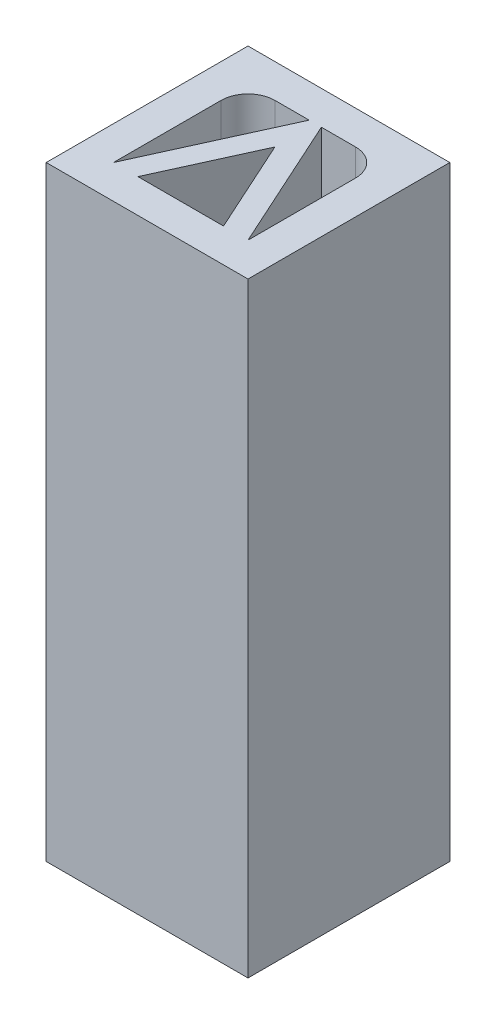
ISO-10303-21;
HEADER;
FILE_DESCRIPTION(('STEP AP214'),'2;1');
FILE_NAME('part.step','',(''),(''),'','','');
FILE_SCHEMA(('AUTOMOTIVE_DESIGN { 1 0 10303 214 1 1 1 1 }'));
ENDSEC;
DATA;
#1=APPLICATION_CONTEXT('core data for automotive mechanical design processes');
#2=APPLICATION_PROTOCOL_DEFINITION('international standard','automotive_design',2000,#1);
#3=PRODUCT_CONTEXT('',#1,'mechanical');
#4=PRODUCT('Part','Part','',(#3));
#5=PRODUCT_RELATED_PRODUCT_CATEGORY('part','',(#4));
#6=PRODUCT_DEFINITION_FORMATION('','',#4);
#7=PRODUCT_DEFINITION_CONTEXT('part definition',#1,'design');
#8=PRODUCT_DEFINITION('design','',#6,#7);
#9=PRODUCT_DEFINITION_SHAPE('','',#8);
#10=(LENGTH_UNIT() NAMED_UNIT(*) SI_UNIT(.MILLI.,.METRE.));
#11=(NAMED_UNIT(*) PLANE_ANGLE_UNIT() SI_UNIT($,.RADIAN.));
#12=(NAMED_UNIT(*) SI_UNIT($,.STERADIAN.) SOLID_ANGLE_UNIT());
#13=UNCERTAINTY_MEASURE_WITH_UNIT(LENGTH_MEASURE(1.E-05),#10,'distance_accuracy_value','');
#14=(GEOMETRIC_REPRESENTATION_CONTEXT(3) GLOBAL_UNCERTAINTY_ASSIGNED_CONTEXT((#13)) GLOBAL_UNIT_ASSIGNED_CONTEXT((#10,
#11,#12)) REPRESENTATION_CONTEXT('',''));
#15=CARTESIAN_POINT('',(0.,0.,0.));
#16=DIRECTION('',(0.,0.,1.));
#17=DIRECTION('',(1.,0.,0.));
#18=AXIS2_PLACEMENT_3D('',#15,#16,#17);
#19=CARTESIAN_POINT('',(2.5,45.,-12.5));
#20=DIRECTION('',(0.,0.,1.));
#21=DIRECTION('',(1.,0.,0.));
#22=AXIS2_PLACEMENT_3D('',#19,#20,#21);
#23=PLANE('',#22);
#24=DIRECTION('',(-1.,0.,0.));
#25=VECTOR('',#24,1.);
#26=CARTESIAN_POINT('',(2.5,0.,-12.5));
#27=LINE('',#26,#25);
#28=CARTESIAN_POINT('',(10.5,0.,-12.5));
#29=VERTEX_POINT('',#28);
#30=CARTESIAN_POINT('',(7.95454545454545,0.,-12.5));
#31=VERTEX_POINT('',#30);
#32=EDGE_CURVE('E200',#29,#31,#27,.T.);
#33=ORIENTED_EDGE('',*,*,#32,.F.);
#34=DIRECTION('',(0.,-1.,0.));
#35=VECTOR('',#34,1.);
#36=CARTESIAN_POINT('',(10.5,45.,-12.5));
#37=LINE('',#36,#35);
#38=CARTESIAN_POINT('',(10.5,45.,-12.5));
#39=VERTEX_POINT('',#38);
#40=EDGE_CURVE('E55',#29,#39,#37,.F.);
#41=ORIENTED_EDGE('',*,*,#40,.T.);
#42=DIRECTION('',(-1.,0.,0.));
#43=VECTOR('',#42,1.);
#44=CARTESIAN_POINT('',(2.5,45.,-12.5));
#45=LINE('',#44,#43);
#46=CARTESIAN_POINT('',(7.95454545454545,45.,-12.5));
#47=VERTEX_POINT('',#46);
#48=EDGE_CURVE('E208',#39,#47,#45,.T.);
#49=ORIENTED_EDGE('',*,*,#48,.T.);
#50=DIRECTION('',(0.,1.,0.));
#51=VECTOR('',#50,1.);
#52=CARTESIAN_POINT('',(7.95454545454545,45.,-12.5));
#53=LINE('',#52,#51);
#54=EDGE_CURVE('E277',#31,#47,#53,.T.);
#55=ORIENTED_EDGE('',*,*,#54,.F.);
#56=EDGE_LOOP('',(#33,#41,#49,#55));
#57=FACE_BOUND('',#56,.T.);
#58=ADVANCED_FACE('F39',(#57),#23,.T.);
#59=CARTESIAN_POINT('',(0.,45.,0.));
#60=DIRECTION('',(0.,-1.,0.));
#61=DIRECTION('',(0.,0.,-1.));
#62=AXIS2_PLACEMENT_3D('',#59,#60,#61);
#63=PLANE('',#62);
#64=DIRECTION('',(0.413802944301184,0.,0.910366477462605));
#65=VECTOR('',#64,1.);
#66=CARTESIAN_POINT('',(12.5,45.,-2.5));
#67=LINE('',#66,#65);
#68=CARTESIAN_POINT('',(12.5,45.,-2.5));
#69=VERTEX_POINT('',#68);
#70=EDGE_CURVE('E181',#47,#69,#67,.T.);
#71=ORIENTED_EDGE('',*,*,#70,.F.);
#72=ORIENTED_EDGE('',*,*,#48,.F.);
#73=CARTESIAN_POINT('',(10.5,45.,-10.5));
#74=DIRECTION('',(0.,-1.,0.));
#75=DIRECTION('',(0.,0.,-1.));
#76=AXIS2_PLACEMENT_3D('',#73,#74,#75);
#77=CIRCLE('',#76,2.);
#78=CARTESIAN_POINT('',(12.5,45.,-10.5));
#79=VERTEX_POINT('',#78);
#80=EDGE_CURVE('E11',#39,#79,#77,.T.);
#81=ORIENTED_EDGE('',*,*,#80,.T.);
#82=DIRECTION('',(0.,0.,-1.));
#83=VECTOR('',#82,1.);
#84=CARTESIAN_POINT('',(12.5,45.,-12.5));
#85=LINE('',#84,#83);
#86=EDGE_CURVE('E203',#69,#79,#85,.T.);
#87=ORIENTED_EDGE('',*,*,#86,.F.);
#88=EDGE_LOOP('',(#71,#72,#81,#87));
#89=FACE_BOUND('',#88,.T.);
#90=DIRECTION('',(-0.413802944301184,0.,-0.910366477462605));
#91=VECTOR('',#90,1.);
#92=CARTESIAN_POINT('',(10.6818181818182,45.,-2.5));
#93=LINE('',#92,#91);
#94=CARTESIAN_POINT('',(10.6818181818182,45.,-2.5));
#95=VERTEX_POINT('',#94);
#96=CARTESIAN_POINT('',(7.5,45.,-9.5));
#97=VERTEX_POINT('',#96);
#98=EDGE_CURVE('E164',#95,#97,#93,.T.);
#99=ORIENTED_EDGE('',*,*,#98,.F.);
#100=DIRECTION('',(1.,0.,0.));
#101=VECTOR('',#100,1.);
#102=CARTESIAN_POINT('',(2.5,45.,-2.5));
#103=LINE('',#102,#101);
#104=CARTESIAN_POINT('',(4.31818181818182,45.,-2.5));
#105=VERTEX_POINT('',#104);
#106=EDGE_CURVE('E165',#105,#95,#103,.T.);
#107=ORIENTED_EDGE('',*,*,#106,.F.);
#108=DIRECTION('',(-0.413802944301184,0.,0.910366477462605));
#109=VECTOR('',#108,1.);
#110=CARTESIAN_POINT('',(7.5,45.,-9.5));
#111=LINE('',#110,#109);
#112=EDGE_CURVE('E148',#97,#105,#111,.T.);
#113=ORIENTED_EDGE('',*,*,#112,.F.);
#114=EDGE_LOOP('',(#99,#107,#113));
#115=FACE_BOUND('',#114,.T.);
#116=DIRECTION('',(0.,0.,1.));
#117=VECTOR('',#116,1.);
#118=CARTESIAN_POINT('',(0.,45.,0.));
#119=LINE('',#118,#117);
#120=CARTESIAN_POINT('',(0.,45.,-15.));
#121=VERTEX_POINT('',#120);
#122=CARTESIAN_POINT('',(0.,45.,0.));
#123=VERTEX_POINT('',#122);
#124=EDGE_CURVE('E232',#121,#123,#119,.T.);
#125=ORIENTED_EDGE('',*,*,#124,.T.);
#126=DIRECTION('',(1.,0.,0.));
#127=VECTOR('',#126,1.);
#128=CARTESIAN_POINT('',(0.,45.,0.));
#129=LINE('',#128,#127);
#130=CARTESIAN_POINT('',(15.,45.,0.));
#131=VERTEX_POINT('',#130);
#132=EDGE_CURVE('E236',#123,#131,#129,.T.);
#133=ORIENTED_EDGE('',*,*,#132,.T.);
#134=DIRECTION('',(0.,0.,-1.));
#135=VECTOR('',#134,1.);
#136=CARTESIAN_POINT('',(15.,45.,0.));
#137=LINE('',#136,#135);
#138=CARTESIAN_POINT('',(15.,45.,-15.));
#139=VERTEX_POINT('',#138);
#140=EDGE_CURVE('E240',#131,#139,#137,.T.);
#141=ORIENTED_EDGE('',*,*,#140,.T.);
#142=DIRECTION('',(-1.,0.,0.));
#143=VECTOR('',#142,1.);
#144=CARTESIAN_POINT('',(0.,45.,-15.));
#145=LINE('',#144,#143);
#146=EDGE_CURVE('E243',#139,#121,#145,.T.);
#147=ORIENTED_EDGE('',*,*,#146,.T.);
#148=EDGE_LOOP('',(#125,#133,#141,#147));
#149=FACE_BOUND('',#148,.T.);
#150=CARTESIAN_POINT('',(7.04545454545455,45.,-12.5));
#151=VERTEX_POINT('',#150);
#152=CARTESIAN_POINT('',(4.5,45.,-12.5));
#153=VERTEX_POINT('',#152);
#154=EDGE_CURVE('E207',#151,#153,#45,.T.);
#155=ORIENTED_EDGE('',*,*,#154,.F.);
#156=DIRECTION('',(0.413802944301184,0.,-0.910366477462605));
#157=VECTOR('',#156,1.);
#158=CARTESIAN_POINT('',(7.5,45.,-13.5));
#159=LINE('',#158,#157);
#160=CARTESIAN_POINT('',(2.5,45.,-2.5));
#161=VERTEX_POINT('',#160);
#162=EDGE_CURVE('E167',#161,#151,#159,.T.);
#163=ORIENTED_EDGE('',*,*,#162,.F.);
#164=DIRECTION('',(0.,0.,1.));
#165=VECTOR('',#164,1.);
#166=CARTESIAN_POINT('',(2.5,45.,-12.5));
#167=LINE('',#166,#165);
#168=CARTESIAN_POINT('',(2.5,45.,-10.5));
#169=VERTEX_POINT('',#168);
#170=EDGE_CURVE('E197',#169,#161,#167,.T.);
#171=ORIENTED_EDGE('',*,*,#170,.F.);
#172=CARTESIAN_POINT('',(4.5,45.,-10.5));
#173=DIRECTION('',(0.,-1.,0.));
#174=DIRECTION('',(0.,0.,-1.));
#175=AXIS2_PLACEMENT_3D('',#172,#173,#174);
#176=CIRCLE('',#175,2.);
#177=EDGE_CURVE('E297',#169,#153,#176,.T.);
#178=ORIENTED_EDGE('',*,*,#177,.T.);
#179=EDGE_LOOP('',(#155,#163,#171,#178));
#180=FACE_BOUND('',#179,.T.);
#181=ADVANCED_FACE('F162',(#89,#115,#149,#180),#63,.F.);
#182=CARTESIAN_POINT('',(0.,0.,0.));
#183=DIRECTION('',(0.,-1.,0.));
#184=DIRECTION('',(0.,0.,-1.));
#185=AXIS2_PLACEMENT_3D('',#182,#183,#184);
#186=PLANE('',#185);
#187=DIRECTION('',(0.,0.,-1.));
#188=VECTOR('',#187,1.);
#189=CARTESIAN_POINT('',(12.5,0.,-12.5));
#190=LINE('',#189,#188);
#191=CARTESIAN_POINT('',(12.5,0.,-2.5));
#192=VERTEX_POINT('',#191);
#193=CARTESIAN_POINT('',(12.5,0.,-10.5));
#194=VERTEX_POINT('',#193);
#195=EDGE_CURVE('E218',#192,#194,#190,.T.);
#196=ORIENTED_EDGE('',*,*,#195,.T.);
#197=CARTESIAN_POINT('',(10.5,0.,-10.5));
#198=DIRECTION('',(0.,-1.,0.));
#199=DIRECTION('',(0.,0.,-1.));
#200=AXIS2_PLACEMENT_3D('',#197,#198,#199);
#201=CIRCLE('',#200,2.);
#202=EDGE_CURVE('E48',#194,#29,#201,.F.);
#203=ORIENTED_EDGE('',*,*,#202,.T.);
#204=ORIENTED_EDGE('',*,*,#32,.T.);
#205=DIRECTION('',(0.413802944301184,0.,0.910366477462605));
#206=VECTOR('',#205,1.);
#207=CARTESIAN_POINT('',(12.5,0.,-2.5));
#208=LINE('',#207,#206);
#209=EDGE_CURVE('E172',#31,#192,#208,.T.);
#210=ORIENTED_EDGE('',*,*,#209,.T.);
#211=EDGE_LOOP('',(#196,#203,#204,#210));
#212=FACE_BOUND('',#211,.T.);
#213=DIRECTION('',(1.,0.,0.));
#214=VECTOR('',#213,1.);
#215=CARTESIAN_POINT('',(2.5,0.,-2.5));
#216=LINE('',#215,#214);
#217=CARTESIAN_POINT('',(4.31818181818182,0.,-2.5));
#218=VERTEX_POINT('',#217);
#219=CARTESIAN_POINT('',(10.6818181818182,0.,-2.5));
#220=VERTEX_POINT('',#219);
#221=EDGE_CURVE('E214',#218,#220,#216,.T.);
#222=ORIENTED_EDGE('',*,*,#221,.T.);
#223=DIRECTION('',(-0.413802944301184,0.,-0.910366477462605));
#224=VECTOR('',#223,1.);
#225=CARTESIAN_POINT('',(10.6818181818182,0.,-2.5));
#226=LINE('',#225,#224);
#227=CARTESIAN_POINT('',(7.5,0.,-9.5));
#228=VERTEX_POINT('',#227);
#229=EDGE_CURVE('E185',#220,#228,#226,.T.);
#230=ORIENTED_EDGE('',*,*,#229,.T.);
#231=DIRECTION('',(-0.413802944301184,0.,0.910366477462605));
#232=VECTOR('',#231,1.);
#233=CARTESIAN_POINT('',(7.5,0.,-9.5));
#234=LINE('',#233,#232);
#235=EDGE_CURVE('E150',#228,#218,#234,.T.);
#236=ORIENTED_EDGE('',*,*,#235,.T.);
#237=EDGE_LOOP('',(#222,#230,#236));
#238=FACE_BOUND('',#237,.T.);
#239=DIRECTION('',(0.413802944301184,0.,-0.910366477462605));
#240=VECTOR('',#239,1.);
#241=CARTESIAN_POINT('',(7.5,0.,-13.5));
#242=LINE('',#241,#240);
#243=CARTESIAN_POINT('',(2.5,0.,-2.5));
#244=VERTEX_POINT('',#243);
#245=CARTESIAN_POINT('',(7.04545454545455,0.,-12.5));
#246=VERTEX_POINT('',#245);
#247=EDGE_CURVE('E176',#244,#246,#242,.T.);
#248=ORIENTED_EDGE('',*,*,#247,.T.);
#249=CARTESIAN_POINT('',(4.5,0.,-12.5));
#250=VERTEX_POINT('',#249);
#251=EDGE_CURVE('E221',#246,#250,#27,.T.);
#252=ORIENTED_EDGE('',*,*,#251,.T.);
#253=CARTESIAN_POINT('',(4.5,0.,-10.5));
#254=DIRECTION('',(0.,-1.,0.));
#255=DIRECTION('',(0.,0.,-1.));
#256=AXIS2_PLACEMENT_3D('',#253,#254,#255);
#257=CIRCLE('',#256,2.);
#258=CARTESIAN_POINT('',(2.5,0.,-10.5));
#259=VERTEX_POINT('',#258);
#260=EDGE_CURVE('E294',#250,#259,#257,.F.);
#261=ORIENTED_EDGE('',*,*,#260,.T.);
#262=DIRECTION('',(0.,0.,1.));
#263=VECTOR('',#262,1.);
#264=CARTESIAN_POINT('',(2.5,0.,-12.5));
#265=LINE('',#264,#263);
#266=EDGE_CURVE('E193',#259,#244,#265,.T.);
#267=ORIENTED_EDGE('',*,*,#266,.T.);
#268=EDGE_LOOP('',(#248,#252,#261,#267));
#269=FACE_BOUND('',#268,.T.);
#270=DIRECTION('',(0.,0.,1.));
#271=VECTOR('',#270,1.);
#272=CARTESIAN_POINT('',(0.,0.,0.));
#273=LINE('',#272,#271);
#274=CARTESIAN_POINT('',(0.,0.,-15.));
#275=VERTEX_POINT('',#274);
#276=CARTESIAN_POINT('',(0.,0.,0.));
#277=VERTEX_POINT('',#276);
#278=EDGE_CURVE('E231',#275,#277,#273,.T.);
#279=ORIENTED_EDGE('',*,*,#278,.F.);
#280=DIRECTION('',(-1.,0.,0.));
#281=VECTOR('',#280,1.);
#282=CARTESIAN_POINT('',(0.,0.,-15.));
#283=LINE('',#282,#281);
#284=CARTESIAN_POINT('',(15.,0.,-15.));
#285=VERTEX_POINT('',#284);
#286=EDGE_CURVE('E237',#285,#275,#283,.T.);
#287=ORIENTED_EDGE('',*,*,#286,.F.);
#288=DIRECTION('',(0.,0.,-1.));
#289=VECTOR('',#288,1.);
#290=CARTESIAN_POINT('',(15.,0.,0.));
#291=LINE('',#290,#289);
#292=CARTESIAN_POINT('',(15.,0.,0.));
#293=VERTEX_POINT('',#292);
#294=EDGE_CURVE('E253',#293,#285,#291,.T.);
#295=ORIENTED_EDGE('',*,*,#294,.F.);
#296=DIRECTION('',(1.,0.,0.));
#297=VECTOR('',#296,1.);
#298=CARTESIAN_POINT('',(0.,0.,0.));
#299=LINE('',#298,#297);
#300=EDGE_CURVE('E250',#277,#293,#299,.T.);
#301=ORIENTED_EDGE('',*,*,#300,.F.);
#302=EDGE_LOOP('',(#279,#287,#295,#301));
#303=FACE_BOUND('',#302,.T.);
#304=ADVANCED_FACE('F306',(#212,#238,#269,#303),#186,.T.);
#305=CARTESIAN_POINT('',(0.,45.,0.));
#306=DIRECTION('',(1.,0.,0.));
#307=DIRECTION('',(0.,0.,-1.));
#308=AXIS2_PLACEMENT_3D('',#305,#306,#307);
#309=PLANE('',#308);
#310=ORIENTED_EDGE('',*,*,#278,.T.);
#311=DIRECTION('',(0.,-1.,0.));
#312=VECTOR('',#311,1.);
#313=CARTESIAN_POINT('',(0.,45.,0.));
#314=LINE('',#313,#312);
#315=EDGE_CURVE('E269',#123,#277,#314,.T.);
#316=ORIENTED_EDGE('',*,*,#315,.F.);
#317=ORIENTED_EDGE('',*,*,#124,.F.);
#318=DIRECTION('',(0.,-1.,0.));
#319=VECTOR('',#318,1.);
#320=CARTESIAN_POINT('',(0.,45.,-15.));
#321=LINE('',#320,#319);
#322=EDGE_CURVE('E246',#121,#275,#321,.T.);
#323=ORIENTED_EDGE('',*,*,#322,.T.);
#324=EDGE_LOOP('',(#310,#316,#317,#323));
#325=FACE_BOUND('',#324,.T.);
#326=ADVANCED_FACE('F364',(#325),#309,.F.);
#327=CARTESIAN_POINT('',(0.,45.,0.));
#328=DIRECTION('',(0.,0.,-1.));
#329=DIRECTION('',(-1.,0.,0.));
#330=AXIS2_PLACEMENT_3D('',#327,#328,#329);
#331=PLANE('',#330);
#332=ORIENTED_EDGE('',*,*,#300,.T.);
#333=DIRECTION('',(0.,-1.,0.));
#334=VECTOR('',#333,1.);
#335=CARTESIAN_POINT('',(15.,45.,0.));
#336=LINE('',#335,#334);
#337=EDGE_CURVE('E265',#131,#293,#336,.T.);
#338=ORIENTED_EDGE('',*,*,#337,.F.);
#339=ORIENTED_EDGE('',*,*,#132,.F.);
#340=ORIENTED_EDGE('',*,*,#315,.T.);
#341=EDGE_LOOP('',(#332,#338,#339,#340));
#342=FACE_BOUND('',#341,.T.);
#343=ADVANCED_FACE('F371',(#342),#331,.F.);
#344=CARTESIAN_POINT('',(15.,45.,0.));
#345=DIRECTION('',(-1.,0.,0.));
#346=DIRECTION('',(0.,0.,1.));
#347=AXIS2_PLACEMENT_3D('',#344,#345,#346);
#348=PLANE('',#347);
#349=ORIENTED_EDGE('',*,*,#294,.T.);
#350=DIRECTION('',(0.,-1.,0.));
#351=VECTOR('',#350,1.);
#352=CARTESIAN_POINT('',(15.,45.,-15.));
#353=LINE('',#352,#351);
#354=EDGE_CURVE('E261',#139,#285,#353,.T.);
#355=ORIENTED_EDGE('',*,*,#354,.F.);
#356=ORIENTED_EDGE('',*,*,#140,.F.);
#357=ORIENTED_EDGE('',*,*,#337,.T.);
#358=EDGE_LOOP('',(#349,#355,#356,#357));
#359=FACE_BOUND('',#358,.T.);
#360=ADVANCED_FACE('F367',(#359),#348,.F.);
#361=CARTESIAN_POINT('',(0.,45.,-15.));
#362=DIRECTION('',(0.,0.,1.));
#363=DIRECTION('',(1.,0.,0.));
#364=AXIS2_PLACEMENT_3D('',#361,#362,#363);
#365=PLANE('',#364);
#366=ORIENTED_EDGE('',*,*,#286,.T.);
#367=ORIENTED_EDGE('',*,*,#322,.F.);
#368=ORIENTED_EDGE('',*,*,#146,.F.);
#369=ORIENTED_EDGE('',*,*,#354,.T.);
#370=EDGE_LOOP('',(#366,#367,#368,#369));
#371=FACE_BOUND('',#370,.T.);
#372=ADVANCED_FACE('F360',(#371),#365,.F.);
#373=CARTESIAN_POINT('',(2.5,45.,-12.5));
#374=DIRECTION('',(1.,0.,0.));
#375=DIRECTION('',(0.,0.,-1.));
#376=AXIS2_PLACEMENT_3D('',#373,#374,#375);
#377=PLANE('',#376);
#378=ORIENTED_EDGE('',*,*,#266,.F.);
#379=DIRECTION('',(0.,-1.,0.));
#380=VECTOR('',#379,1.);
#381=CARTESIAN_POINT('',(2.5,45.,-10.5));
#382=LINE('',#381,#380);
#383=EDGE_CURVE('E285',#259,#169,#382,.F.);
#384=ORIENTED_EDGE('',*,*,#383,.T.);
#385=ORIENTED_EDGE('',*,*,#170,.T.);
#386=DIRECTION('',(0.,-1.,0.));
#387=VECTOR('',#386,1.);
#388=CARTESIAN_POINT('',(2.5,45.,-2.5));
#389=LINE('',#388,#387);
#390=EDGE_CURVE('E227',#161,#244,#389,.T.);
#391=ORIENTED_EDGE('',*,*,#390,.T.);
#392=EDGE_LOOP('',(#378,#384,#385,#391));
#393=FACE_BOUND('',#392,.T.);
#394=ADVANCED_FACE('F321',(#393),#377,.T.);
#395=CARTESIAN_POINT('',(2.5,45.,-2.5));
#396=DIRECTION('',(0.,0.,-1.));
#397=DIRECTION('',(-1.,0.,0.));
#398=AXIS2_PLACEMENT_3D('',#395,#396,#397);
#399=PLANE('',#398);
#400=DIRECTION('',(0.,-1.,0.));
#401=VECTOR('',#400,1.);
#402=CARTESIAN_POINT('',(4.31818181818182,45.,-2.5));
#403=LINE('',#402,#401);
#404=EDGE_CURVE('E156',#105,#218,#403,.T.);
#405=ORIENTED_EDGE('',*,*,#404,.F.);
#406=ORIENTED_EDGE('',*,*,#106,.T.);
#407=DIRECTION('',(0.,-1.,0.));
#408=VECTOR('',#407,1.);
#409=CARTESIAN_POINT('',(10.6818181818182,45.,-2.5));
#410=LINE('',#409,#408);
#411=EDGE_CURVE('E157',#95,#220,#410,.T.);
#412=ORIENTED_EDGE('',*,*,#411,.T.);
#413=ORIENTED_EDGE('',*,*,#221,.F.);
#414=EDGE_LOOP('',(#405,#406,#412,#413));
#415=FACE_BOUND('',#414,.T.);
#416=ADVANCED_FACE('F351',(#415),#399,.T.);
#417=CARTESIAN_POINT('',(12.5,45.,-12.5));
#418=DIRECTION('',(-1.,0.,0.));
#419=DIRECTION('',(0.,0.,1.));
#420=AXIS2_PLACEMENT_3D('',#417,#418,#419);
#421=PLANE('',#420);
#422=ORIENTED_EDGE('',*,*,#86,.T.);
#423=DIRECTION('',(0.,-1.,0.));
#424=VECTOR('',#423,1.);
#425=CARTESIAN_POINT('',(12.5,0.,-10.5));
#426=LINE('',#425,#424);
#427=EDGE_CURVE('E288',#79,#194,#426,.T.);
#428=ORIENTED_EDGE('',*,*,#427,.T.);
#429=ORIENTED_EDGE('',*,*,#195,.F.);
#430=DIRECTION('',(0.,-1.,0.));
#431=VECTOR('',#430,1.);
#432=CARTESIAN_POINT('',(12.5,45.,-2.5));
#433=LINE('',#432,#431);
#434=EDGE_CURVE('E211',#69,#192,#433,.T.);
#435=ORIENTED_EDGE('',*,*,#434,.F.);
#436=EDGE_LOOP('',(#422,#428,#429,#435));
#437=FACE_BOUND('',#436,.T.);
#438=ADVANCED_FACE('F347',(#437),#421,.T.);
#439=ORIENTED_EDGE('',*,*,#154,.T.);
#440=DIRECTION('',(0.,-1.,0.));
#441=VECTOR('',#440,1.);
#442=CARTESIAN_POINT('',(4.5,0.,-12.5));
#443=LINE('',#442,#441);
#444=EDGE_CURVE('E281',#153,#250,#443,.T.);
#445=ORIENTED_EDGE('',*,*,#444,.T.);
#446=ORIENTED_EDGE('',*,*,#251,.F.);
#447=DIRECTION('',(0.,-1.,0.));
#448=VECTOR('',#447,1.);
#449=CARTESIAN_POINT('',(7.04545454545455,45.,-12.5));
#450=LINE('',#449,#448);
#451=EDGE_CURVE('E273',#151,#246,#450,.T.);
#452=ORIENTED_EDGE('',*,*,#451,.F.);
#453=EDGE_LOOP('',(#439,#445,#446,#452));
#454=FACE_BOUND('',#453,.T.);
#455=ADVANCED_FACE('F312',(#454),#23,.T.);
#456=CARTESIAN_POINT('',(12.5,45.,-2.5));
#457=DIRECTION('',(0.910366477462605,0.,-0.413802944301184));
#458=DIRECTION('',(-0.413802944301184,0.,-0.910366477462605));
#459=AXIS2_PLACEMENT_3D('',#456,#457,#458);
#460=PLANE('',#459);
#461=ORIENTED_EDGE('',*,*,#209,.F.);
#462=ORIENTED_EDGE('',*,*,#54,.T.);
#463=ORIENTED_EDGE('',*,*,#70,.T.);
#464=ORIENTED_EDGE('',*,*,#434,.T.);
#465=EDGE_LOOP('',(#461,#462,#463,#464));
#466=FACE_BOUND('',#465,.T.);
#467=ADVANCED_FACE('F328',(#466),#460,.T.);
#468=CARTESIAN_POINT('',(7.5,45.,-13.5));
#469=DIRECTION('',(-0.910366477462605,0.,-0.413802944301184));
#470=DIRECTION('',(-0.413802944301184,0.,0.910366477462605));
#471=AXIS2_PLACEMENT_3D('',#468,#469,#470);
#472=PLANE('',#471);
#473=ORIENTED_EDGE('',*,*,#162,.T.);
#474=ORIENTED_EDGE('',*,*,#451,.T.);
#475=ORIENTED_EDGE('',*,*,#247,.F.);
#476=ORIENTED_EDGE('',*,*,#390,.F.);
#477=EDGE_LOOP('',(#473,#474,#475,#476));
#478=FACE_BOUND('',#477,.T.);
#479=ADVANCED_FACE('F326',(#478),#472,.T.);
#480=CARTESIAN_POINT('',(7.5,45.,-9.5));
#481=DIRECTION('',(0.910366477462605,0.,0.413802944301184));
#482=DIRECTION('',(0.413802944301184,0.,-0.910366477462605));
#483=AXIS2_PLACEMENT_3D('',#480,#481,#482);
#484=PLANE('',#483);
#485=ORIENTED_EDGE('',*,*,#235,.F.);
#486=DIRECTION('',(0.,-1.,0.));
#487=VECTOR('',#486,1.);
#488=CARTESIAN_POINT('',(7.5,45.,-9.5));
#489=LINE('',#488,#487);
#490=EDGE_CURVE('E144',#97,#228,#489,.T.);
#491=ORIENTED_EDGE('',*,*,#490,.F.);
#492=ORIENTED_EDGE('',*,*,#112,.T.);
#493=ORIENTED_EDGE('',*,*,#404,.T.);
#494=EDGE_LOOP('',(#485,#491,#492,#493));
#495=FACE_BOUND('',#494,.T.);
#496=ADVANCED_FACE('F146',(#495),#484,.T.);
#497=CARTESIAN_POINT('',(10.6818181818182,45.,-2.5));
#498=DIRECTION('',(-0.910366477462605,0.,0.413802944301184));
#499=DIRECTION('',(0.413802944301184,0.,0.910366477462605));
#500=AXIS2_PLACEMENT_3D('',#497,#498,#499);
#501=PLANE('',#500);
#502=ORIENTED_EDGE('',*,*,#229,.F.);
#503=ORIENTED_EDGE('',*,*,#411,.F.);
#504=ORIENTED_EDGE('',*,*,#98,.T.);
#505=ORIENTED_EDGE('',*,*,#490,.T.);
#506=EDGE_LOOP('',(#502,#503,#504,#505));
#507=FACE_BOUND('',#506,.T.);
#508=ADVANCED_FACE('F170',(#507),#501,.T.);
#509=CARTESIAN_POINT('',(4.5,45.,-10.5));
#510=DIRECTION('',(0.,1.,0.));
#511=DIRECTION('',(0.,0.,1.));
#512=AXIS2_PLACEMENT_3D('',#509,#510,#511);
#513=CYLINDRICAL_SURFACE('',#512,2.);
#514=ORIENTED_EDGE('',*,*,#177,.F.);
#515=ORIENTED_EDGE('',*,*,#383,.F.);
#516=ORIENTED_EDGE('',*,*,#260,.F.);
#517=ORIENTED_EDGE('',*,*,#444,.F.);
#518=EDGE_LOOP('',(#514,#515,#516,#517));
#519=FACE_BOUND('',#518,.T.);
#520=ADVANCED_FACE('F317',(#519),#513,.F.);
#521=CARTESIAN_POINT('',(10.5,45.,-10.5));
#522=DIRECTION('',(0.,1.,0.));
#523=DIRECTION('',(0.,0.,1.));
#524=AXIS2_PLACEMENT_3D('',#521,#522,#523);
#525=CYLINDRICAL_SURFACE('',#524,2.);
#526=ORIENTED_EDGE('',*,*,#80,.F.);
#527=ORIENTED_EDGE('',*,*,#40,.F.);
#528=ORIENTED_EDGE('',*,*,#202,.F.);
#529=ORIENTED_EDGE('',*,*,#427,.F.);
#530=EDGE_LOOP('',(#526,#527,#528,#529));
#531=FACE_BOUND('',#530,.T.);
#532=ADVANCED_FACE('F41',(#531),#525,.F.);
#533=CLOSED_SHELL('',(#58,#181,#304,#326,#343,#360,#372,#394,#416,#438,#455,#467,#479,#496,#508,
#520,#532));
#534=MANIFOLD_SOLID_BREP('B2',#533);
#535=ADVANCED_BREP_SHAPE_REPRESENTATION('',(#18,#534),#14);
#536=SHAPE_DEFINITION_REPRESENTATION(#9,#535);
ENDSEC;
END-ISO-10303-21;
